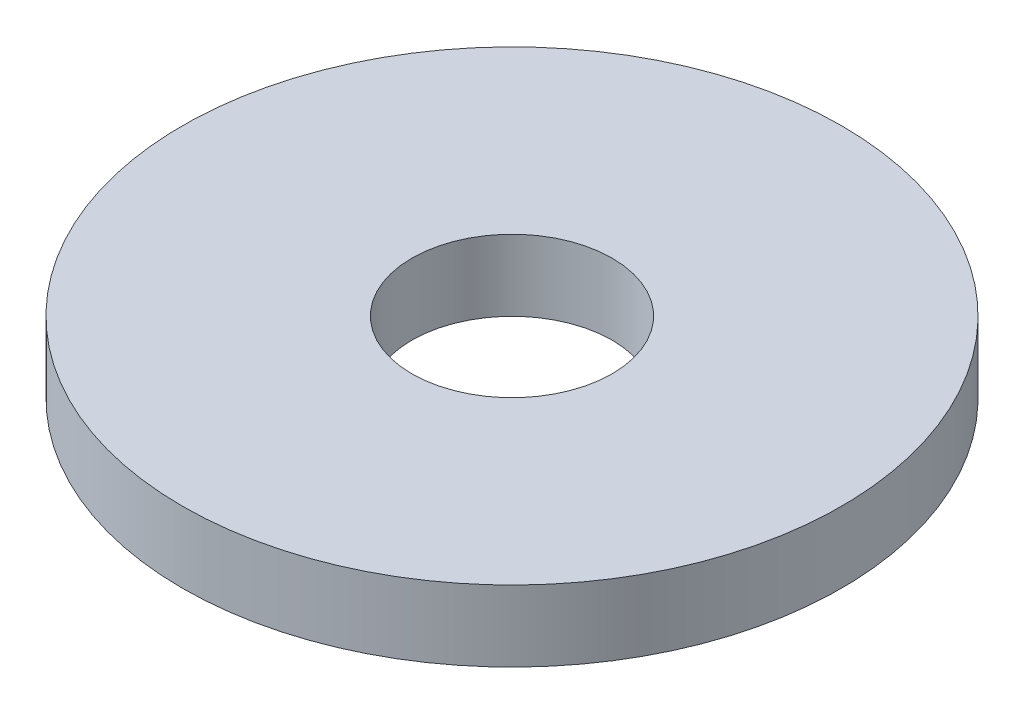
ISO-10303-21;
HEADER;
FILE_DESCRIPTION(('STEP AP214'),'2;1');
FILE_NAME('part.step','',(''),(''),'','','');
FILE_SCHEMA(('AUTOMOTIVE_DESIGN { 1 0 10303 214 1 1 1 1 }'));
ENDSEC;
DATA;
#1=APPLICATION_CONTEXT('core data for automotive mechanical design processes');
#2=APPLICATION_PROTOCOL_DEFINITION('international standard','automotive_design',2000,#1);
#3=PRODUCT_CONTEXT('',#1,'mechanical');
#4=PRODUCT('Part','Part','',(#3));
#5=PRODUCT_RELATED_PRODUCT_CATEGORY('part','',(#4));
#6=PRODUCT_DEFINITION_FORMATION('','',#4);
#7=PRODUCT_DEFINITION_CONTEXT('part definition',#1,'design');
#8=PRODUCT_DEFINITION('design','',#6,#7);
#9=PRODUCT_DEFINITION_SHAPE('','',#8);
#10=(LENGTH_UNIT() NAMED_UNIT(*) SI_UNIT(.MILLI.,.METRE.));
#11=(NAMED_UNIT(*) PLANE_ANGLE_UNIT() SI_UNIT($,.RADIAN.));
#12=(NAMED_UNIT(*) SI_UNIT($,.STERADIAN.) SOLID_ANGLE_UNIT());
#13=UNCERTAINTY_MEASURE_WITH_UNIT(LENGTH_MEASURE(1.E-05),#10,'distance_accuracy_value','');
#14=(GEOMETRIC_REPRESENTATION_CONTEXT(3) GLOBAL_UNCERTAINTY_ASSIGNED_CONTEXT((#13)) GLOBAL_UNIT_ASSIGNED_CONTEXT((#10,
#11,#12)) REPRESENTATION_CONTEXT('',''));
#15=CARTESIAN_POINT('',(0.,0.,0.));
#16=DIRECTION('',(0.,0.,1.));
#17=DIRECTION('',(1.,0.,0.));
#18=AXIS2_PLACEMENT_3D('',#15,#16,#17);
#19=CARTESIAN_POINT('',(0.,0.8382,0.));
#20=DIRECTION('',(0.,1.,0.));
#21=DIRECTION('',(0.,0.,1.));
#22=AXIS2_PLACEMENT_3D('',#19,#20,#21);
#23=PLANE('',#22);
#24=CARTESIAN_POINT('',(0.,0.8382,0.));
#25=DIRECTION('',(0.,1.,0.));
#26=DIRECTION('',(0.,0.,1.));
#27=AXIS2_PLACEMENT_3D('',#24,#25,#26);
#28=CIRCLE('',#27,1.1811);
#29=CARTESIAN_POINT('',(0.,0.8382,1.1811));
#30=VERTEX_POINT('',#29);
#31=EDGE_CURVE('E26',#30,#30,#28,.F.);
#32=ORIENTED_EDGE('',*,*,#31,.T.);
#33=EDGE_LOOP('',(#32));
#34=FACE_BOUND('',#33,.T.);
#35=CARTESIAN_POINT('',(0.,0.8382,0.));
#36=DIRECTION('',(0.,1.,0.));
#37=DIRECTION('',(0.,0.,1.));
#38=AXIS2_PLACEMENT_3D('',#35,#36,#37);
#39=CIRCLE('',#38,3.8862);
#40=CARTESIAN_POINT('',(0.,0.8382,3.8862));
#41=VERTEX_POINT('',#40);
#42=EDGE_CURVE('E17',#41,#41,#39,.F.);
#43=ORIENTED_EDGE('',*,*,#42,.F.);
#44=EDGE_LOOP('',(#43));
#45=FACE_BOUND('',#44,.T.);
#46=ADVANCED_FACE('F14',(#34,#45),#23,.T.);
#47=CARTESIAN_POINT('',(0.,0.,0.));
#48=DIRECTION('',(0.,1.,0.));
#49=DIRECTION('',(0.,0.,1.));
#50=AXIS2_PLACEMENT_3D('',#47,#48,#49);
#51=CYLINDRICAL_SURFACE('',#50,3.8862);
#52=ORIENTED_EDGE('',*,*,#42,.T.);
#53=EDGE_LOOP('',(#52));
#54=FACE_BOUND('',#53,.T.);
#55=CARTESIAN_POINT('',(0.,0.,0.));
#56=DIRECTION('',(0.,1.,0.));
#57=DIRECTION('',(0.,0.,1.));
#58=AXIS2_PLACEMENT_3D('',#55,#56,#57);
#59=CIRCLE('',#58,3.8862);
#60=CARTESIAN_POINT('',(0.,0.,3.8862));
#61=VERTEX_POINT('',#60);
#62=EDGE_CURVE('E21',#61,#61,#59,.T.);
#63=ORIENTED_EDGE('',*,*,#62,.T.);
#64=EDGE_LOOP('',(#63));
#65=FACE_BOUND('',#64,.T.);
#66=ADVANCED_FACE('F34',(#54,#65),#51,.T.);
#67=CARTESIAN_POINT('',(0.,0.,0.));
#68=DIRECTION('',(0.,1.,0.));
#69=DIRECTION('',(0.,0.,1.));
#70=AXIS2_PLACEMENT_3D('',#67,#68,#69);
#71=CYLINDRICAL_SURFACE('',#70,1.1811);
#72=ORIENTED_EDGE('',*,*,#31,.F.);
#73=EDGE_LOOP('',(#72));
#74=FACE_BOUND('',#73,.T.);
#75=CARTESIAN_POINT('',(0.,0.,0.));
#76=DIRECTION('',(0.,1.,0.));
#77=DIRECTION('',(0.,0.,1.));
#78=AXIS2_PLACEMENT_3D('',#75,#76,#77);
#79=CIRCLE('',#78,1.1811);
#80=CARTESIAN_POINT('',(0.,0.,1.1811));
#81=VERTEX_POINT('',#80);
#82=EDGE_CURVE('E10',#81,#81,#79,.F.);
#83=ORIENTED_EDGE('',*,*,#82,.T.);
#84=EDGE_LOOP('',(#83));
#85=FACE_BOUND('',#84,.T.);
#86=ADVANCED_FACE('F42',(#74,#85),#71,.F.);
#87=CARTESIAN_POINT('',(0.,0.,0.));
#88=DIRECTION('',(0.,1.,0.));
#89=DIRECTION('',(0.,0.,1.));
#90=AXIS2_PLACEMENT_3D('',#87,#88,#89);
#91=PLANE('',#90);
#92=ORIENTED_EDGE('',*,*,#82,.F.);
#93=EDGE_LOOP('',(#92));
#94=FACE_BOUND('',#93,.T.);
#95=ORIENTED_EDGE('',*,*,#62,.F.);
#96=EDGE_LOOP('',(#95));
#97=FACE_BOUND('',#96,.T.);
#98=ADVANCED_FACE('F43',(#94,#97),#91,.F.);
#99=CLOSED_SHELL('',(#46,#66,#86,#98));
#100=MANIFOLD_SOLID_BREP('B1',#99);
#101=ADVANCED_BREP_SHAPE_REPRESENTATION('',(#18,#100),#14);
#102=SHAPE_DEFINITION_REPRESENTATION(#9,#101);
ENDSEC;
END-ISO-10303-21;
